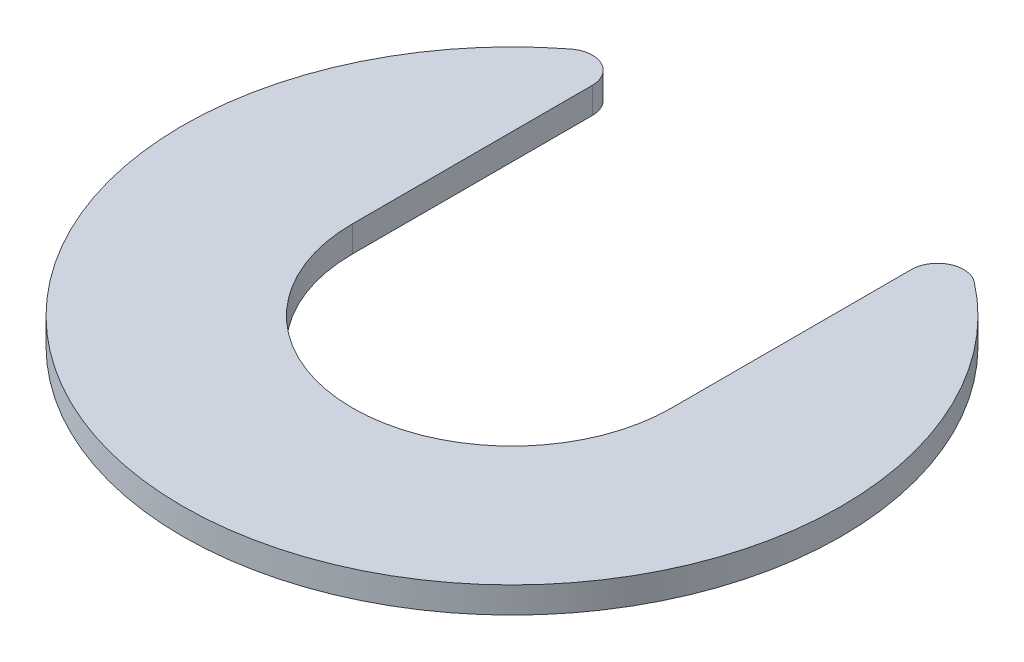
ISO-10303-21;
HEADER;
FILE_DESCRIPTION(('STEP AP214'),'2;1');
FILE_NAME('part.step','',(''),(''),'','','');
FILE_SCHEMA(('AUTOMOTIVE_DESIGN { 1 0 10303 214 1 1 1 1 }'));
ENDSEC;
DATA;
#1=APPLICATION_CONTEXT('core data for automotive mechanical design processes');
#2=APPLICATION_PROTOCOL_DEFINITION('international standard','automotive_design',2000,#1);
#3=PRODUCT_CONTEXT('',#1,'mechanical');
#4=PRODUCT('Part','Part','',(#3));
#5=PRODUCT_RELATED_PRODUCT_CATEGORY('part','',(#4));
#6=PRODUCT_DEFINITION_FORMATION('','',#4);
#7=PRODUCT_DEFINITION_CONTEXT('part definition',#1,'design');
#8=PRODUCT_DEFINITION('design','',#6,#7);
#9=PRODUCT_DEFINITION_SHAPE('','',#8);
#10=(LENGTH_UNIT() NAMED_UNIT(*) SI_UNIT(.MILLI.,.METRE.));
#11=(NAMED_UNIT(*) PLANE_ANGLE_UNIT() SI_UNIT($,.RADIAN.));
#12=(NAMED_UNIT(*) SI_UNIT($,.STERADIAN.) SOLID_ANGLE_UNIT());
#13=UNCERTAINTY_MEASURE_WITH_UNIT(LENGTH_MEASURE(1.E-05),#10,'distance_accuracy_value','');
#14=(GEOMETRIC_REPRESENTATION_CONTEXT(3) GLOBAL_UNCERTAINTY_ASSIGNED_CONTEXT((#13)) GLOBAL_UNIT_ASSIGNED_CONTEXT((#10,
#11,#12)) REPRESENTATION_CONTEXT('',''));
#15=CARTESIAN_POINT('',(0.,0.,0.));
#16=DIRECTION('',(0.,0.,1.));
#17=DIRECTION('',(1.,0.,0.));
#18=AXIS2_PLACEMENT_3D('',#15,#16,#17);
#19=CARTESIAN_POINT('',(0.,1.,0.));
#20=DIRECTION('',(0.,-1.,0.));
#21=DIRECTION('',(0.,0.,-1.));
#22=AXIS2_PLACEMENT_3D('',#19,#20,#21);
#23=CYLINDRICAL_SURFACE('',#22,12.6);
#24=CARTESIAN_POINT('',(0.,0.,0.));
#25=DIRECTION('',(0.,1.,0.));
#26=DIRECTION('',(0.,0.,1.));
#27=AXIS2_PLACEMENT_3D('',#24,#25,#26);
#28=CIRCLE('',#27,12.6);
#29=CARTESIAN_POINT('',(-7.71206896551724,0.,-9.96413529971898));
#30=VERTEX_POINT('',#29);
#31=CARTESIAN_POINT('',(7.71206896551724,0.,-9.96413529971898));
#32=VERTEX_POINT('',#31);
#33=EDGE_CURVE('E109',#30,#32,#28,.T.);
#34=ORIENTED_EDGE('',*,*,#33,.T.);
#35=DIRECTION('',(0.,-1.,0.));
#36=VECTOR('',#35,1.);
#37=CARTESIAN_POINT('',(7.71206896551724,1.,-9.96413529971898));
#38=LINE('',#37,#36);
#39=CARTESIAN_POINT('',(7.71206896551724,1.,-9.96413529971898));
#40=VERTEX_POINT('',#39);
#41=EDGE_CURVE('E56',#32,#40,#38,.F.);
#42=ORIENTED_EDGE('',*,*,#41,.T.);
#43=CARTESIAN_POINT('',(0.,1.,0.));
#44=DIRECTION('',(0.,1.,0.));
#45=DIRECTION('',(0.,0.,1.));
#46=AXIS2_PLACEMENT_3D('',#43,#44,#45);
#47=CIRCLE('',#46,12.6);
#48=CARTESIAN_POINT('',(-7.71206896551724,1.,-9.96413529971898));
#49=VERTEX_POINT('',#48);
#50=EDGE_CURVE('E118',#49,#40,#47,.T.);
#51=ORIENTED_EDGE('',*,*,#50,.F.);
#52=DIRECTION('',(0.,-1.,0.));
#53=VECTOR('',#52,1.);
#54=CARTESIAN_POINT('',(-7.71206896551724,1.,-9.96413529971898));
#55=LINE('',#54,#53);
#56=EDGE_CURVE('E133',#49,#30,#55,.T.);
#57=ORIENTED_EDGE('',*,*,#56,.T.);
#58=EDGE_LOOP('',(#34,#42,#51,#57));
#59=FACE_BOUND('',#58,.T.);
#60=ADVANCED_FACE('F34',(#59),#23,.T.);
#61=CARTESIAN_POINT('',(0.,1.,0.));
#62=DIRECTION('',(0.,1.,0.));
#63=DIRECTION('',(0.,0.,1.));
#64=AXIS2_PLACEMENT_3D('',#61,#62,#63);
#65=PLANE('',#64);
#66=ORIENTED_EDGE('',*,*,#50,.T.);
#67=CARTESIAN_POINT('',(7.1,1.,-9.1733309108524));
#68=DIRECTION('',(0.,1.,0.));
#69=DIRECTION('',(0.,0.,1.));
#70=AXIS2_PLACEMENT_3D('',#67,#68,#69);
#71=CIRCLE('',#70,1.);
#72=CARTESIAN_POINT('',(6.1,1.,-9.1733309108524));
#73=VERTEX_POINT('',#72);
#74=EDGE_CURVE('E42',#40,#73,#71,.T.);
#75=ORIENTED_EDGE('',*,*,#74,.T.);
#76=DIRECTION('',(0.,0.,-1.));
#77=VECTOR('',#76,1.);
#78=CARTESIAN_POINT('',(6.1,1.,0.));
#79=LINE('',#78,#77);
#80=CARTESIAN_POINT('',(6.1,1.,0.));
#81=VERTEX_POINT('',#80);
#82=EDGE_CURVE('E100',#81,#73,#79,.T.);
#83=ORIENTED_EDGE('',*,*,#82,.F.);
#84=CARTESIAN_POINT('',(0.,1.,0.));
#85=DIRECTION('',(0.,1.,0.));
#86=DIRECTION('',(0.,0.,1.));
#87=AXIS2_PLACEMENT_3D('',#84,#85,#86);
#88=CIRCLE('',#87,6.1);
#89=CARTESIAN_POINT('',(-6.1,1.,0.));
#90=VERTEX_POINT('',#89);
#91=EDGE_CURVE('E90',#90,#81,#88,.T.);
#92=ORIENTED_EDGE('',*,*,#91,.F.);
#93=DIRECTION('',(0.,0.,1.));
#94=VECTOR('',#93,1.);
#95=CARTESIAN_POINT('',(-6.1,1.,0.));
#96=LINE('',#95,#94);
#97=CARTESIAN_POINT('',(-6.1,1.,-9.1733309108524));
#98=VERTEX_POINT('',#97);
#99=EDGE_CURVE('E113',#98,#90,#96,.T.);
#100=ORIENTED_EDGE('',*,*,#99,.F.);
#101=CARTESIAN_POINT('',(-7.1,1.,-9.1733309108524));
#102=DIRECTION('',(0.,1.,0.));
#103=DIRECTION('',(0.,0.,1.));
#104=AXIS2_PLACEMENT_3D('',#101,#102,#103);
#105=CIRCLE('',#104,1.);
#106=EDGE_CURVE('E49',#98,#49,#105,.T.);
#107=ORIENTED_EDGE('',*,*,#106,.T.);
#108=EDGE_LOOP('',(#66,#75,#83,#92,#100,#107));
#109=FACE_BOUND('',#108,.T.);
#110=ADVANCED_FACE('F111',(#109),#65,.T.);
#111=CARTESIAN_POINT('',(0.,0.,0.));
#112=DIRECTION('',(0.,1.,0.));
#113=DIRECTION('',(0.,0.,1.));
#114=AXIS2_PLACEMENT_3D('',#111,#112,#113);
#115=PLANE('',#114);
#116=DIRECTION('',(0.,0.,1.));
#117=VECTOR('',#116,1.);
#118=CARTESIAN_POINT('',(6.1,0.,0.));
#119=LINE('',#118,#117);
#120=CARTESIAN_POINT('',(6.1,0.,-9.1733309108524));
#121=VERTEX_POINT('',#120);
#122=CARTESIAN_POINT('',(6.1,0.,0.));
#123=VERTEX_POINT('',#122);
#124=EDGE_CURVE('E108',#121,#123,#119,.T.);
#125=ORIENTED_EDGE('',*,*,#124,.F.);
#126=CARTESIAN_POINT('',(7.1,0.,-9.1733309108524));
#127=DIRECTION('',(0.,1.,0.));
#128=DIRECTION('',(0.,0.,1.));
#129=AXIS2_PLACEMENT_3D('',#126,#127,#128);
#130=CIRCLE('',#129,1.);
#131=EDGE_CURVE('E131',#121,#32,#130,.F.);
#132=ORIENTED_EDGE('',*,*,#131,.T.);
#133=ORIENTED_EDGE('',*,*,#33,.F.);
#134=CARTESIAN_POINT('',(-7.1,0.,-9.1733309108524));
#135=DIRECTION('',(0.,1.,0.));
#136=DIRECTION('',(0.,0.,1.));
#137=AXIS2_PLACEMENT_3D('',#134,#135,#136);
#138=CIRCLE('',#137,1.);
#139=CARTESIAN_POINT('',(-6.1,0.,-9.1733309108524));
#140=VERTEX_POINT('',#139);
#141=EDGE_CURVE('E129',#30,#140,#138,.F.);
#142=ORIENTED_EDGE('',*,*,#141,.T.);
#143=DIRECTION('',(0.,0.,-1.));
#144=VECTOR('',#143,1.);
#145=CARTESIAN_POINT('',(-6.1,0.,0.));
#146=LINE('',#145,#144);
#147=CARTESIAN_POINT('',(-6.1,0.,0.));
#148=VERTEX_POINT('',#147);
#149=EDGE_CURVE('E120',#148,#140,#146,.T.);
#150=ORIENTED_EDGE('',*,*,#149,.F.);
#151=CARTESIAN_POINT('',(0.,0.,0.));
#152=DIRECTION('',(0.,-1.,0.));
#153=DIRECTION('',(0.,0.,-1.));
#154=AXIS2_PLACEMENT_3D('',#151,#152,#153);
#155=CIRCLE('',#154,6.1);
#156=EDGE_CURVE('E124',#123,#148,#155,.T.);
#157=ORIENTED_EDGE('',*,*,#156,.F.);
#158=EDGE_LOOP('',(#125,#132,#133,#142,#150,#157));
#159=FACE_BOUND('',#158,.T.);
#160=ADVANCED_FACE('F140',(#159),#115,.F.);
#161=CARTESIAN_POINT('',(0.,1.,0.));
#162=DIRECTION('',(0.,-1.,0.));
#163=DIRECTION('',(0.,0.,-1.));
#164=AXIS2_PLACEMENT_3D('',#161,#162,#163);
#165=CYLINDRICAL_SURFACE('',#164,6.1);
#166=ORIENTED_EDGE('',*,*,#156,.T.);
#167=DIRECTION('',(0.,-1.,0.));
#168=VECTOR('',#167,1.);
#169=CARTESIAN_POINT('',(-6.1,1.,0.));
#170=LINE('',#169,#168);
#171=EDGE_CURVE('E96',#90,#148,#170,.T.);
#172=ORIENTED_EDGE('',*,*,#171,.F.);
#173=ORIENTED_EDGE('',*,*,#91,.T.);
#174=DIRECTION('',(0.,-1.,0.));
#175=VECTOR('',#174,1.);
#176=CARTESIAN_POINT('',(6.1,1.,0.));
#177=LINE('',#176,#175);
#178=EDGE_CURVE('E94',#81,#123,#177,.T.);
#179=ORIENTED_EDGE('',*,*,#178,.T.);
#180=EDGE_LOOP('',(#166,#172,#173,#179));
#181=FACE_BOUND('',#180,.T.);
#182=ADVANCED_FACE('F93',(#181),#165,.F.);
#183=CARTESIAN_POINT('',(6.1,1.,0.));
#184=DIRECTION('',(-1.,0.,0.));
#185=DIRECTION('',(0.,0.,1.));
#186=AXIS2_PLACEMENT_3D('',#183,#184,#185);
#187=PLANE('',#186);
#188=ORIENTED_EDGE('',*,*,#82,.T.);
#189=DIRECTION('',(0.,1.,0.));
#190=VECTOR('',#189,1.);
#191=CARTESIAN_POINT('',(6.1,0.,-9.1733309108524));
#192=LINE('',#191,#190);
#193=EDGE_CURVE('E126',#73,#121,#192,.F.);
#194=ORIENTED_EDGE('',*,*,#193,.T.);
#195=ORIENTED_EDGE('',*,*,#124,.T.);
#196=ORIENTED_EDGE('',*,*,#178,.F.);
#197=EDGE_LOOP('',(#188,#194,#195,#196));
#198=FACE_BOUND('',#197,.T.);
#199=ADVANCED_FACE('F104',(#198),#187,.T.);
#200=CARTESIAN_POINT('',(-6.1,1.,0.));
#201=DIRECTION('',(1.,0.,0.));
#202=DIRECTION('',(0.,0.,-1.));
#203=AXIS2_PLACEMENT_3D('',#200,#201,#202);
#204=PLANE('',#203);
#205=ORIENTED_EDGE('',*,*,#149,.T.);
#206=DIRECTION('',(0.,1.,0.));
#207=VECTOR('',#206,1.);
#208=CARTESIAN_POINT('',(-6.1,1.,-9.1733309108524));
#209=LINE('',#208,#207);
#210=EDGE_CURVE('E11',#140,#98,#209,.T.);
#211=ORIENTED_EDGE('',*,*,#210,.T.);
#212=ORIENTED_EDGE('',*,*,#99,.T.);
#213=ORIENTED_EDGE('',*,*,#171,.T.);
#214=EDGE_LOOP('',(#205,#211,#212,#213));
#215=FACE_BOUND('',#214,.T.);
#216=ADVANCED_FACE('F142',(#215),#204,.T.);
#217=CARTESIAN_POINT('',(7.1,1.,-9.1733309108524));
#218=DIRECTION('',(0.,-1.,0.));
#219=DIRECTION('',(0.,0.,-1.));
#220=AXIS2_PLACEMENT_3D('',#217,#218,#219);
#221=CYLINDRICAL_SURFACE('',#220,1.);
#222=ORIENTED_EDGE('',*,*,#74,.F.);
#223=ORIENTED_EDGE('',*,*,#41,.F.);
#224=ORIENTED_EDGE('',*,*,#131,.F.);
#225=ORIENTED_EDGE('',*,*,#193,.F.);
#226=EDGE_LOOP('',(#222,#223,#224,#225));
#227=FACE_BOUND('',#226,.T.);
#228=ADVANCED_FACE('F144',(#227),#221,.T.);
#229=CARTESIAN_POINT('',(-7.1,1.,-9.1733309108524));
#230=DIRECTION('',(0.,-1.,0.));
#231=DIRECTION('',(0.,0.,-1.));
#232=AXIS2_PLACEMENT_3D('',#229,#230,#231);
#233=CYLINDRICAL_SURFACE('',#232,1.);
#234=ORIENTED_EDGE('',*,*,#141,.F.);
#235=ORIENTED_EDGE('',*,*,#56,.F.);
#236=ORIENTED_EDGE('',*,*,#106,.F.);
#237=ORIENTED_EDGE('',*,*,#210,.F.);
#238=EDGE_LOOP('',(#234,#235,#236,#237));
#239=FACE_BOUND('',#238,.T.);
#240=ADVANCED_FACE('F36',(#239),#233,.T.);
#241=CLOSED_SHELL('',(#60,#110,#160,#182,#199,#216,#228,#240));
#242=MANIFOLD_SOLID_BREP('B2',#241);
#243=ADVANCED_BREP_SHAPE_REPRESENTATION('',(#18,#242),#14);
#244=SHAPE_DEFINITION_REPRESENTATION(#9,#243);
ENDSEC;
END-ISO-10303-21;
